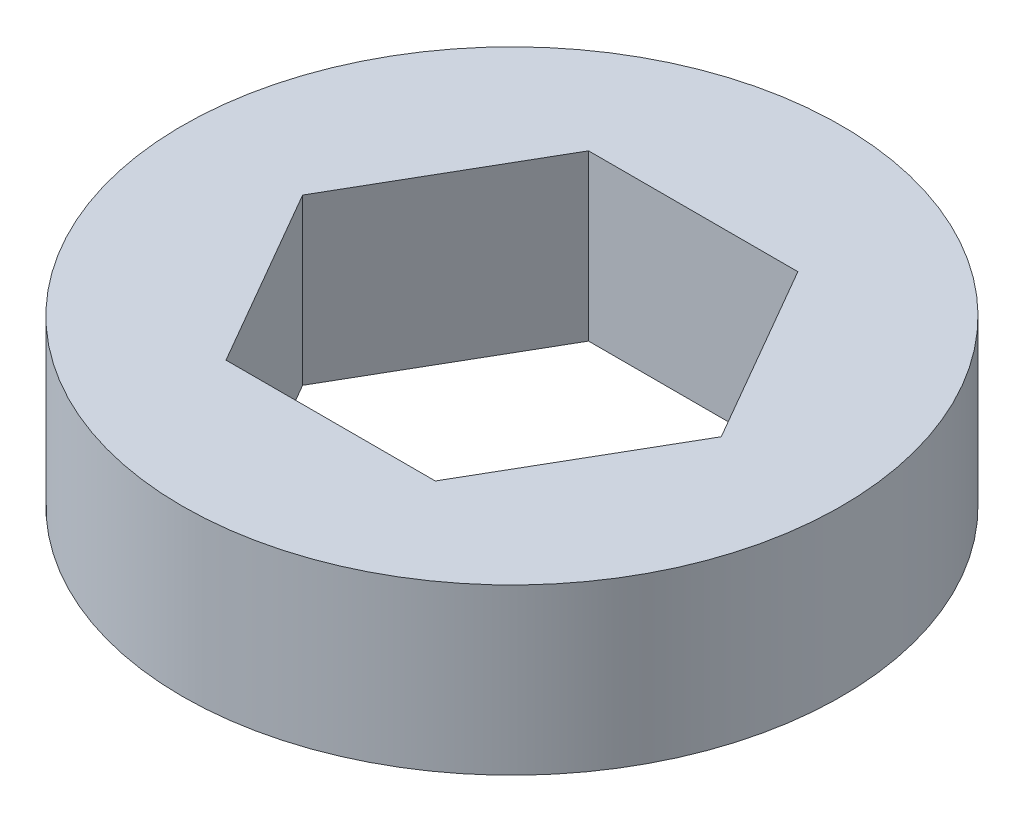
ISO-10303-21;
HEADER;
FILE_DESCRIPTION(('STEP AP214'),'2;1');
FILE_NAME('part.step','',(''),(''),'','','');
FILE_SCHEMA(('AUTOMOTIVE_DESIGN { 1 0 10303 214 1 1 1 1 }'));
ENDSEC;
DATA;
#1=APPLICATION_CONTEXT('core data for automotive mechanical design processes');
#2=APPLICATION_PROTOCOL_DEFINITION('international standard','automotive_design',2000,#1);
#3=PRODUCT_CONTEXT('',#1,'mechanical');
#4=PRODUCT('Part','Part','',(#3));
#5=PRODUCT_RELATED_PRODUCT_CATEGORY('part','',(#4));
#6=PRODUCT_DEFINITION_FORMATION('','',#4);
#7=PRODUCT_DEFINITION_CONTEXT('part definition',#1,'design');
#8=PRODUCT_DEFINITION('design','',#6,#7);
#9=PRODUCT_DEFINITION_SHAPE('','',#8);
#10=(LENGTH_UNIT() NAMED_UNIT(*) SI_UNIT(.MILLI.,.METRE.));
#11=(NAMED_UNIT(*) PLANE_ANGLE_UNIT() SI_UNIT($,.RADIAN.));
#12=(NAMED_UNIT(*) SI_UNIT($,.STERADIAN.) SOLID_ANGLE_UNIT());
#13=UNCERTAINTY_MEASURE_WITH_UNIT(LENGTH_MEASURE(1.E-05),#10,'distance_accuracy_value','');
#14=(GEOMETRIC_REPRESENTATION_CONTEXT(3) GLOBAL_UNCERTAINTY_ASSIGNED_CONTEXT((#13)) GLOBAL_UNIT_ASSIGNED_CONTEXT((#10,
#11,#12)) REPRESENTATION_CONTEXT('',''));
#15=CARTESIAN_POINT('',(0.,0.,0.));
#16=DIRECTION('',(0.,0.,1.));
#17=DIRECTION('',(1.,0.,0.));
#18=AXIS2_PLACEMENT_3D('',#15,#16,#17);
#19=CARTESIAN_POINT('',(0.,10.,0.));
#20=DIRECTION('',(0.,1.,0.));
#21=DIRECTION('',(0.,0.,1.));
#22=AXIS2_PLACEMENT_3D('',#19,#20,#21);
#23=PLANE('',#22);
#24=CARTESIAN_POINT('',(0.,10.,0.));
#25=DIRECTION('',(0.,1.,0.));
#26=DIRECTION('',(0.,0.,1.));
#27=AXIS2_PLACEMENT_3D('',#24,#25,#26);
#28=CIRCLE('',#27,20.);
#29=CARTESIAN_POINT('',(0.,10.,20.));
#30=VERTEX_POINT('',#29);
#31=EDGE_CURVE('E11',#30,#30,#28,.T.);
#32=ORIENTED_EDGE('',*,*,#31,.T.);
#33=EDGE_LOOP('',(#32));
#34=FACE_BOUND('',#33,.T.);
#35=DIRECTION('',(-0.5,0.,-0.866025403784438));
#36=VECTOR('',#35,1.);
#37=CARTESIAN_POINT('',(12.7017059221718,10.,0.));
#38=LINE('',#37,#36);
#39=CARTESIAN_POINT('',(12.7017059221718,10.,0.));
#40=VERTEX_POINT('',#39);
#41=CARTESIAN_POINT('',(6.35085296108588,10.,-11.));
#42=VERTEX_POINT('',#41);
#43=EDGE_CURVE('E93',#40,#42,#38,.T.);
#44=ORIENTED_EDGE('',*,*,#43,.F.);
#45=DIRECTION('',(0.5,0.,-0.866025403784439));
#46=VECTOR('',#45,1.);
#47=CARTESIAN_POINT('',(6.35085296108589,10.,11.));
#48=LINE('',#47,#46);
#49=CARTESIAN_POINT('',(6.35085296108589,10.,11.));
#50=VERTEX_POINT('',#49);
#51=EDGE_CURVE('E85',#50,#40,#48,.T.);
#52=ORIENTED_EDGE('',*,*,#51,.F.);
#53=DIRECTION('',(1.,0.,0.));
#54=VECTOR('',#53,1.);
#55=CARTESIAN_POINT('',(-6.35085296108588,10.,11.));
#56=LINE('',#55,#54);
#57=CARTESIAN_POINT('',(-6.35085296108588,10.,11.));
#58=VERTEX_POINT('',#57);
#59=EDGE_CURVE('E113',#58,#50,#56,.T.);
#60=ORIENTED_EDGE('',*,*,#59,.F.);
#61=DIRECTION('',(0.5,0.,0.866025403784438));
#62=VECTOR('',#61,1.);
#63=CARTESIAN_POINT('',(-12.7017059221718,10.,0.));
#64=LINE('',#63,#62);
#65=CARTESIAN_POINT('',(-12.7017059221718,10.,0.));
#66=VERTEX_POINT('',#65);
#67=EDGE_CURVE('E111',#66,#58,#64,.T.);
#68=ORIENTED_EDGE('',*,*,#67,.F.);
#69=DIRECTION('',(-0.5,0.,0.866025403784438));
#70=VECTOR('',#69,1.);
#71=CARTESIAN_POINT('',(-6.35085296108588,10.,-11.));
#72=LINE('',#71,#70);
#73=CARTESIAN_POINT('',(-6.35085296108588,10.,-11.));
#74=VERTEX_POINT('',#73);
#75=EDGE_CURVE('E107',#74,#66,#72,.T.);
#76=ORIENTED_EDGE('',*,*,#75,.F.);
#77=DIRECTION('',(-1.,0.,0.));
#78=VECTOR('',#77,1.);
#79=CARTESIAN_POINT('',(6.35085296108588,10.,-11.));
#80=LINE('',#79,#78);
#81=EDGE_CURVE('E105',#42,#74,#80,.T.);
#82=ORIENTED_EDGE('',*,*,#81,.F.);
#83=EDGE_LOOP('',(#44,#52,#60,#68,#76,#82));
#84=FACE_BOUND('',#83,.T.);
#85=ADVANCED_FACE('F32',(#34,#84),#23,.T.);
#86=CARTESIAN_POINT('',(0.,0.,0.));
#87=DIRECTION('',(0.,1.,0.));
#88=DIRECTION('',(0.,0.,1.));
#89=AXIS2_PLACEMENT_3D('',#86,#87,#88);
#90=PLANE('',#89);
#91=CARTESIAN_POINT('',(0.,0.,0.));
#92=DIRECTION('',(0.,1.,0.));
#93=DIRECTION('',(0.,0.,1.));
#94=AXIS2_PLACEMENT_3D('',#91,#92,#93);
#95=CIRCLE('',#94,20.);
#96=CARTESIAN_POINT('',(0.,0.,20.));
#97=VERTEX_POINT('',#96);
#98=EDGE_CURVE('E36',#97,#97,#95,.T.);
#99=ORIENTED_EDGE('',*,*,#98,.F.);
#100=EDGE_LOOP('',(#99));
#101=FACE_BOUND('',#100,.T.);
#102=DIRECTION('',(0.5,0.,-0.866025403784439));
#103=VECTOR('',#102,1.);
#104=CARTESIAN_POINT('',(6.35085296108589,0.,11.));
#105=LINE('',#104,#103);
#106=CARTESIAN_POINT('',(6.35085296108589,0.,11.));
#107=VERTEX_POINT('',#106);
#108=CARTESIAN_POINT('',(12.7017059221718,0.,0.));
#109=VERTEX_POINT('',#108);
#110=EDGE_CURVE('E55',#107,#109,#105,.T.);
#111=ORIENTED_EDGE('',*,*,#110,.T.);
#112=DIRECTION('',(-0.5,0.,-0.866025403784438));
#113=VECTOR('',#112,1.);
#114=CARTESIAN_POINT('',(12.7017059221718,0.,0.));
#115=LINE('',#114,#113);
#116=CARTESIAN_POINT('',(6.35085296108588,0.,-11.));
#117=VERTEX_POINT('',#116);
#118=EDGE_CURVE('E100',#109,#117,#115,.T.);
#119=ORIENTED_EDGE('',*,*,#118,.T.);
#120=DIRECTION('',(-1.,0.,0.));
#121=VECTOR('',#120,1.);
#122=CARTESIAN_POINT('',(6.35085296108588,0.,-11.));
#123=LINE('',#122,#121);
#124=CARTESIAN_POINT('',(-6.35085296108588,0.,-11.));
#125=VERTEX_POINT('',#124);
#126=EDGE_CURVE('E117',#117,#125,#123,.T.);
#127=ORIENTED_EDGE('',*,*,#126,.T.);
#128=DIRECTION('',(-0.5,0.,0.866025403784438));
#129=VECTOR('',#128,1.);
#130=CARTESIAN_POINT('',(-6.35085296108588,0.,-11.));
#131=LINE('',#130,#129);
#132=CARTESIAN_POINT('',(-12.7017059221718,0.,0.));
#133=VERTEX_POINT('',#132);
#134=EDGE_CURVE('E120',#125,#133,#131,.T.);
#135=ORIENTED_EDGE('',*,*,#134,.T.);
#136=DIRECTION('',(0.5,0.,0.866025403784438));
#137=VECTOR('',#136,1.);
#138=CARTESIAN_POINT('',(-12.7017059221718,0.,0.));
#139=LINE('',#138,#137);
#140=CARTESIAN_POINT('',(-6.35085296108588,0.,11.));
#141=VERTEX_POINT('',#140);
#142=EDGE_CURVE('E123',#133,#141,#139,.T.);
#143=ORIENTED_EDGE('',*,*,#142,.T.);
#144=DIRECTION('',(1.,0.,0.));
#145=VECTOR('',#144,1.);
#146=CARTESIAN_POINT('',(-6.35085296108588,0.,11.));
#147=LINE('',#146,#145);
#148=EDGE_CURVE('E94',#141,#107,#147,.T.);
#149=ORIENTED_EDGE('',*,*,#148,.T.);
#150=EDGE_LOOP('',(#111,#119,#127,#135,#143,#149));
#151=FACE_BOUND('',#150,.T.);
#152=ADVANCED_FACE('F140',(#101,#151),#90,.F.);
#153=CARTESIAN_POINT('',(0.,10.,0.));
#154=DIRECTION('',(0.,-1.,0.));
#155=DIRECTION('',(0.,0.,-1.));
#156=AXIS2_PLACEMENT_3D('',#153,#154,#155);
#157=CYLINDRICAL_SURFACE('',#156,20.);
#158=ORIENTED_EDGE('',*,*,#31,.F.);
#159=EDGE_LOOP('',(#158));
#160=FACE_BOUND('',#159,.T.);
#161=ORIENTED_EDGE('',*,*,#98,.T.);
#162=EDGE_LOOP('',(#161));
#163=FACE_BOUND('',#162,.T.);
#164=ADVANCED_FACE('F34',(#160,#163),#157,.T.);
#165=CARTESIAN_POINT('',(6.35085296108589,10.,11.));
#166=DIRECTION('',(-0.866025403784439,0.,-0.5));
#167=DIRECTION('',(-0.5,0.,0.866025403784439));
#168=AXIS2_PLACEMENT_3D('',#165,#166,#167);
#169=PLANE('',#168);
#170=ORIENTED_EDGE('',*,*,#110,.F.);
#171=DIRECTION('',(0.,-1.,0.));
#172=VECTOR('',#171,1.);
#173=CARTESIAN_POINT('',(6.35085296108589,10.,11.));
#174=LINE('',#173,#172);
#175=EDGE_CURVE('E89',#50,#107,#174,.T.);
#176=ORIENTED_EDGE('',*,*,#175,.F.);
#177=ORIENTED_EDGE('',*,*,#51,.T.);
#178=DIRECTION('',(0.,-1.,0.));
#179=VECTOR('',#178,1.);
#180=CARTESIAN_POINT('',(12.7017059221718,10.,0.));
#181=LINE('',#180,#179);
#182=EDGE_CURVE('E88',#40,#109,#181,.T.);
#183=ORIENTED_EDGE('',*,*,#182,.T.);
#184=EDGE_LOOP('',(#170,#176,#177,#183));
#185=FACE_BOUND('',#184,.T.);
#186=ADVANCED_FACE('F87',(#185),#169,.T.);
#187=CARTESIAN_POINT('',(12.7017059221718,10.,0.));
#188=DIRECTION('',(-0.866025403784438,0.,0.5));
#189=DIRECTION('',(0.5,0.,0.866025403784438));
#190=AXIS2_PLACEMENT_3D('',#187,#188,#189);
#191=PLANE('',#190);
#192=ORIENTED_EDGE('',*,*,#118,.F.);
#193=ORIENTED_EDGE('',*,*,#182,.F.);
#194=ORIENTED_EDGE('',*,*,#43,.T.);
#195=DIRECTION('',(0.,-1.,0.));
#196=VECTOR('',#195,1.);
#197=CARTESIAN_POINT('',(6.35085296108588,10.,-11.));
#198=LINE('',#197,#196);
#199=EDGE_CURVE('E101',#42,#117,#198,.T.);
#200=ORIENTED_EDGE('',*,*,#199,.T.);
#201=EDGE_LOOP('',(#192,#193,#194,#200));
#202=FACE_BOUND('',#201,.T.);
#203=ADVANCED_FACE('F97',(#202),#191,.T.);
#204=CARTESIAN_POINT('',(6.35085296108588,10.,-11.));
#205=DIRECTION('',(0.,0.,1.));
#206=DIRECTION('',(1.,0.,0.));
#207=AXIS2_PLACEMENT_3D('',#204,#205,#206);
#208=PLANE('',#207);
#209=ORIENTED_EDGE('',*,*,#126,.F.);
#210=ORIENTED_EDGE('',*,*,#199,.F.);
#211=ORIENTED_EDGE('',*,*,#81,.T.);
#212=DIRECTION('',(0.,-1.,0.));
#213=VECTOR('',#212,1.);
#214=CARTESIAN_POINT('',(-6.35085296108588,10.,-11.));
#215=LINE('',#214,#213);
#216=EDGE_CURVE('E132',#74,#125,#215,.T.);
#217=ORIENTED_EDGE('',*,*,#216,.T.);
#218=EDGE_LOOP('',(#209,#210,#211,#217));
#219=FACE_BOUND('',#218,.T.);
#220=ADVANCED_FACE('F136',(#219),#208,.T.);
#221=CARTESIAN_POINT('',(-6.35085296108588,10.,-11.));
#222=DIRECTION('',(0.866025403784439,0.,0.5));
#223=DIRECTION('',(0.5,0.,-0.866025403784439));
#224=AXIS2_PLACEMENT_3D('',#221,#222,#223);
#225=PLANE('',#224);
#226=ORIENTED_EDGE('',*,*,#134,.F.);
#227=ORIENTED_EDGE('',*,*,#216,.F.);
#228=ORIENTED_EDGE('',*,*,#75,.T.);
#229=DIRECTION('',(0.,-1.,0.));
#230=VECTOR('',#229,1.);
#231=CARTESIAN_POINT('',(-12.7017059221718,10.,0.));
#232=LINE('',#231,#230);
#233=EDGE_CURVE('E130',#66,#133,#232,.T.);
#234=ORIENTED_EDGE('',*,*,#233,.T.);
#235=EDGE_LOOP('',(#226,#227,#228,#234));
#236=FACE_BOUND('',#235,.T.);
#237=ADVANCED_FACE('F148',(#236),#225,.T.);
#238=CARTESIAN_POINT('',(-12.7017059221718,10.,0.));
#239=DIRECTION('',(0.866025403784438,0.,-0.5));
#240=DIRECTION('',(-0.5,0.,-0.866025403784438));
#241=AXIS2_PLACEMENT_3D('',#238,#239,#240);
#242=PLANE('',#241);
#243=ORIENTED_EDGE('',*,*,#142,.F.);
#244=ORIENTED_EDGE('',*,*,#233,.F.);
#245=ORIENTED_EDGE('',*,*,#67,.T.);
#246=DIRECTION('',(0.,-1.,0.));
#247=VECTOR('',#246,1.);
#248=CARTESIAN_POINT('',(-6.35085296108588,10.,11.));
#249=LINE('',#248,#247);
#250=EDGE_CURVE('E47',#58,#141,#249,.T.);
#251=ORIENTED_EDGE('',*,*,#250,.T.);
#252=EDGE_LOOP('',(#243,#244,#245,#251));
#253=FACE_BOUND('',#252,.T.);
#254=ADVANCED_FACE('F146',(#253),#242,.T.);
#255=CARTESIAN_POINT('',(-6.35085296108588,10.,11.));
#256=DIRECTION('',(0.,0.,-1.));
#257=DIRECTION('',(-1.,0.,0.));
#258=AXIS2_PLACEMENT_3D('',#255,#256,#257);
#259=PLANE('',#258);
#260=ORIENTED_EDGE('',*,*,#148,.F.);
#261=ORIENTED_EDGE('',*,*,#250,.F.);
#262=ORIENTED_EDGE('',*,*,#59,.T.);
#263=ORIENTED_EDGE('',*,*,#175,.T.);
#264=EDGE_LOOP('',(#260,#261,#262,#263));
#265=FACE_BOUND('',#264,.T.);
#266=ADVANCED_FACE('F142',(#265),#259,.T.);
#267=CLOSED_SHELL('',(#85,#152,#164,#186,#203,#220,#237,#254,#266));
#268=MANIFOLD_SOLID_BREP('B2',#267);
#269=ADVANCED_BREP_SHAPE_REPRESENTATION('',(#18,#268),#14);
#270=SHAPE_DEFINITION_REPRESENTATION(#9,#269);
ENDSEC;
END-ISO-10303-21;
